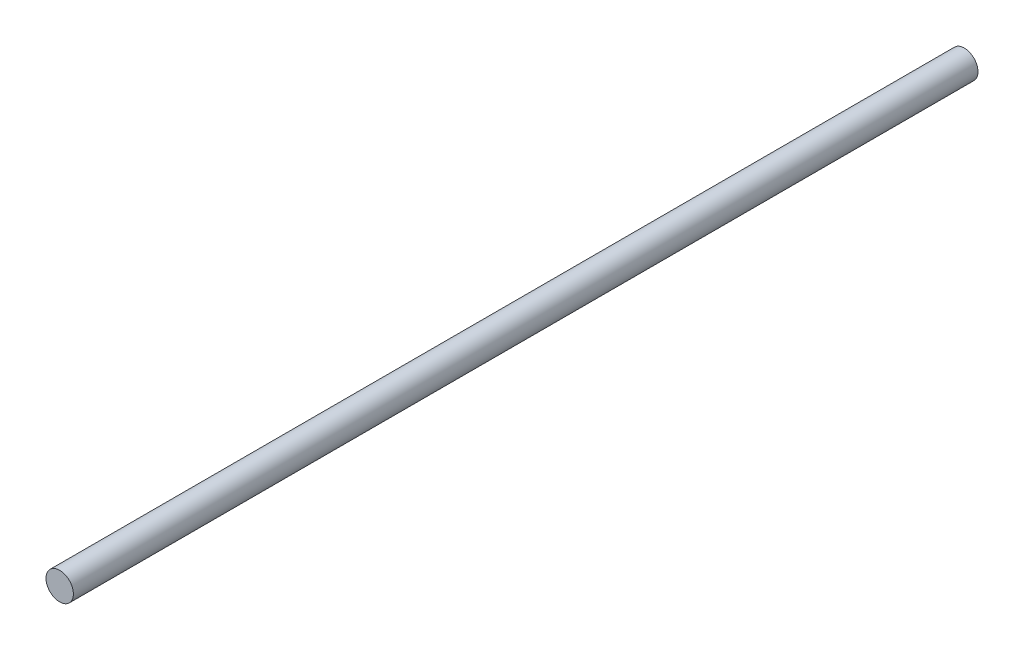
ISO-10303-21;
HEADER;
FILE_DESCRIPTION(('STEP AP214'),'2;1');
FILE_NAME('part.step','',(''),(''),'','','');
FILE_SCHEMA(('AUTOMOTIVE_DESIGN { 1 0 10303 214 1 1 1 1 }'));
ENDSEC;
DATA;
#1=APPLICATION_CONTEXT('core data for automotive mechanical design processes');
#2=APPLICATION_PROTOCOL_DEFINITION('international standard','automotive_design',2000,#1);
#3=PRODUCT_CONTEXT('',#1,'mechanical');
#4=PRODUCT('Part','Part','',(#3));
#5=PRODUCT_RELATED_PRODUCT_CATEGORY('part','',(#4));
#6=PRODUCT_DEFINITION_FORMATION('','',#4);
#7=PRODUCT_DEFINITION_CONTEXT('part definition',#1,'design');
#8=PRODUCT_DEFINITION('design','',#6,#7);
#9=PRODUCT_DEFINITION_SHAPE('','',#8);
#10=(LENGTH_UNIT() NAMED_UNIT(*) SI_UNIT(.MILLI.,.METRE.));
#11=(NAMED_UNIT(*) PLANE_ANGLE_UNIT() SI_UNIT($,.RADIAN.));
#12=(NAMED_UNIT(*) SI_UNIT($,.STERADIAN.) SOLID_ANGLE_UNIT());
#13=UNCERTAINTY_MEASURE_WITH_UNIT(LENGTH_MEASURE(1.E-05),#10,'distance_accuracy_value','');
#14=(GEOMETRIC_REPRESENTATION_CONTEXT(3) GLOBAL_UNCERTAINTY_ASSIGNED_CONTEXT((#13)) GLOBAL_UNIT_ASSIGNED_CONTEXT((#10,
#11,#12)) REPRESENTATION_CONTEXT('',''));
#15=CARTESIAN_POINT('',(0.,0.,0.));
#16=DIRECTION('',(0.,0.,1.));
#17=DIRECTION('',(1.,0.,0.));
#18=AXIS2_PLACEMENT_3D('',#15,#16,#17);
#19=CARTESIAN_POINT('',(0.,0.,264.));
#20=DIRECTION('',(0.,0.,-1.));
#21=DIRECTION('',(-1.,0.,0.));
#22=AXIS2_PLACEMENT_3D('',#19,#20,#21);
#23=CYLINDRICAL_SURFACE('',#22,4.);
#24=CARTESIAN_POINT('',(0.,0.,264.));
#25=DIRECTION('',(0.,0.,1.));
#26=DIRECTION('',(1.,0.,0.));
#27=AXIS2_PLACEMENT_3D('',#24,#25,#26);
#28=CIRCLE('',#27,4.);
#29=CARTESIAN_POINT('',(4.,0.,264.));
#30=VERTEX_POINT('',#29);
#31=EDGE_CURVE('E10',#30,#30,#28,.T.);
#32=ORIENTED_EDGE('',*,*,#31,.F.);
#33=EDGE_LOOP('',(#32));
#34=FACE_BOUND('',#33,.T.);
#35=CARTESIAN_POINT('',(0.,0.,0.));
#36=DIRECTION('',(0.,0.,1.));
#37=DIRECTION('',(1.,0.,0.));
#38=AXIS2_PLACEMENT_3D('',#35,#36,#37);
#39=CIRCLE('',#38,4.);
#40=CARTESIAN_POINT('',(4.,0.,0.));
#41=VERTEX_POINT('',#40);
#42=EDGE_CURVE('E39',#41,#41,#39,.T.);
#43=ORIENTED_EDGE('',*,*,#42,.T.);
#44=EDGE_LOOP('',(#43));
#45=FACE_BOUND('',#44,.T.);
#46=ADVANCED_FACE('F36',(#34,#45),#23,.T.);
#47=CARTESIAN_POINT('',(0.,0.,264.));
#48=DIRECTION('',(0.,0.,1.));
#49=DIRECTION('',(1.,0.,0.));
#50=AXIS2_PLACEMENT_3D('',#47,#48,#49);
#51=PLANE('',#50);
#52=ORIENTED_EDGE('',*,*,#31,.T.);
#53=EDGE_LOOP('',(#52));
#54=FACE_BOUND('',#53,.T.);
#55=ADVANCED_FACE('F53',(#54),#51,.T.);
#56=CARTESIAN_POINT('',(0.,0.,0.));
#57=DIRECTION('',(0.,0.,1.));
#58=DIRECTION('',(1.,0.,0.));
#59=AXIS2_PLACEMENT_3D('',#56,#57,#58);
#60=PLANE('',#59);
#61=ORIENTED_EDGE('',*,*,#42,.F.);
#62=EDGE_LOOP('',(#61));
#63=FACE_BOUND('',#62,.T.);
#64=ADVANCED_FACE('F51',(#63),#60,.F.);
#65=CLOSED_SHELL('',(#46,#55,#64));
#66=MANIFOLD_SOLID_BREP('B2',#65);
#67=ADVANCED_BREP_SHAPE_REPRESENTATION('',(#18,#66),#14);
#68=SHAPE_DEFINITION_REPRESENTATION(#9,#67);
ENDSEC;
END-ISO-10303-21;
